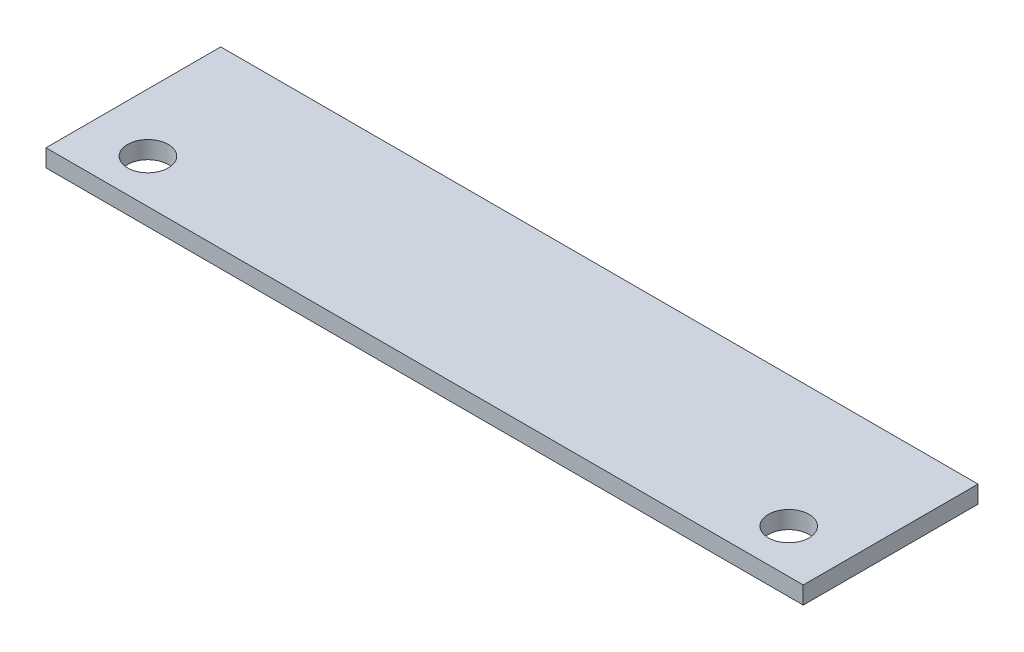
ISO-10303-21;
HEADER;
FILE_DESCRIPTION(('STEP AP214'),'2;1');
FILE_NAME('part.step','',(''),(''),'','','');
FILE_SCHEMA(('AUTOMOTIVE_DESIGN { 1 0 10303 214 1 1 1 1 }'));
ENDSEC;
DATA;
#1=APPLICATION_CONTEXT('core data for automotive mechanical design processes');
#2=APPLICATION_PROTOCOL_DEFINITION('international standard','automotive_design',2000,#1);
#3=PRODUCT_CONTEXT('',#1,'mechanical');
#4=PRODUCT('Part','Part','',(#3));
#5=PRODUCT_RELATED_PRODUCT_CATEGORY('part','',(#4));
#6=PRODUCT_DEFINITION_FORMATION('','',#4);
#7=PRODUCT_DEFINITION_CONTEXT('part definition',#1,'design');
#8=PRODUCT_DEFINITION('design','',#6,#7);
#9=PRODUCT_DEFINITION_SHAPE('','',#8);
#10=(LENGTH_UNIT() NAMED_UNIT(*) SI_UNIT(.MILLI.,.METRE.));
#11=(NAMED_UNIT(*) PLANE_ANGLE_UNIT() SI_UNIT($,.RADIAN.));
#12=(NAMED_UNIT(*) SI_UNIT($,.STERADIAN.) SOLID_ANGLE_UNIT());
#13=UNCERTAINTY_MEASURE_WITH_UNIT(LENGTH_MEASURE(1.E-05),#10,'distance_accuracy_value','');
#14=(GEOMETRIC_REPRESENTATION_CONTEXT(3) GLOBAL_UNCERTAINTY_ASSIGNED_CONTEXT((#13)) GLOBAL_UNIT_ASSIGNED_CONTEXT((#10,
#11,#12)) REPRESENTATION_CONTEXT('',''));
#15=CARTESIAN_POINT('',(0.,0.,0.));
#16=DIRECTION('',(0.,0.,1.));
#17=DIRECTION('',(1.,0.,0.));
#18=AXIS2_PLACEMENT_3D('',#15,#16,#17);
#19=CARTESIAN_POINT('',(130.,6.,30.));
#20=DIRECTION('',(-1.,0.,0.));
#21=DIRECTION('',(0.,0.,1.));
#22=AXIS2_PLACEMENT_3D('',#19,#20,#21);
#23=PLANE('',#22);
#24=DIRECTION('',(0.,0.,-1.));
#25=VECTOR('',#24,1.);
#26=CARTESIAN_POINT('',(130.,0.,30.));
#27=LINE('',#26,#25);
#28=CARTESIAN_POINT('',(130.,0.,30.));
#29=VERTEX_POINT('',#28);
#30=CARTESIAN_POINT('',(130.,0.,-30.));
#31=VERTEX_POINT('',#30);
#32=EDGE_CURVE('E96',#29,#31,#27,.T.);
#33=ORIENTED_EDGE('',*,*,#32,.T.);
#34=DIRECTION('',(0.,-1.,0.));
#35=VECTOR('',#34,1.);
#36=CARTESIAN_POINT('',(130.,6.,-30.));
#37=LINE('',#36,#35);
#38=CARTESIAN_POINT('',(130.,6.,-30.));
#39=VERTEX_POINT('',#38);
#40=EDGE_CURVE('E11',#39,#31,#37,.T.);
#41=ORIENTED_EDGE('',*,*,#40,.F.);
#42=DIRECTION('',(0.,0.,-1.));
#43=VECTOR('',#42,1.);
#44=CARTESIAN_POINT('',(130.,6.,30.));
#45=LINE('',#44,#43);
#46=CARTESIAN_POINT('',(130.,6.,30.));
#47=VERTEX_POINT('',#46);
#48=EDGE_CURVE('E84',#47,#39,#45,.T.);
#49=ORIENTED_EDGE('',*,*,#48,.F.);
#50=DIRECTION('',(0.,-1.,0.));
#51=VECTOR('',#50,1.);
#52=CARTESIAN_POINT('',(130.,6.,30.));
#53=LINE('',#52,#51);
#54=EDGE_CURVE('E92',#47,#29,#53,.T.);
#55=ORIENTED_EDGE('',*,*,#54,.T.);
#56=EDGE_LOOP('',(#33,#41,#49,#55));
#57=FACE_BOUND('',#56,.T.);
#58=ADVANCED_FACE('F33',(#57),#23,.F.);
#59=CARTESIAN_POINT('',(-130.,6.,-30.));
#60=DIRECTION('',(0.,0.,1.));
#61=DIRECTION('',(1.,0.,0.));
#62=AXIS2_PLACEMENT_3D('',#59,#60,#61);
#63=PLANE('',#62);
#64=DIRECTION('',(-1.,0.,0.));
#65=VECTOR('',#64,1.);
#66=CARTESIAN_POINT('',(-130.,0.,-30.));
#67=LINE('',#66,#65);
#68=CARTESIAN_POINT('',(-130.,0.,-30.));
#69=VERTEX_POINT('',#68);
#70=EDGE_CURVE('E88',#31,#69,#67,.T.);
#71=ORIENTED_EDGE('',*,*,#70,.T.);
#72=DIRECTION('',(0.,-1.,0.));
#73=VECTOR('',#72,1.);
#74=CARTESIAN_POINT('',(-130.,6.,-30.));
#75=LINE('',#74,#73);
#76=CARTESIAN_POINT('',(-130.,6.,-30.));
#77=VERTEX_POINT('',#76);
#78=EDGE_CURVE('E41',#77,#69,#75,.T.);
#79=ORIENTED_EDGE('',*,*,#78,.F.);
#80=DIRECTION('',(-1.,0.,0.));
#81=VECTOR('',#80,1.);
#82=CARTESIAN_POINT('',(-130.,6.,-30.));
#83=LINE('',#82,#81);
#84=EDGE_CURVE('E79',#39,#77,#83,.T.);
#85=ORIENTED_EDGE('',*,*,#84,.F.);
#86=ORIENTED_EDGE('',*,*,#40,.T.);
#87=EDGE_LOOP('',(#71,#79,#85,#86));
#88=FACE_BOUND('',#87,.T.);
#89=ADVANCED_FACE('F87',(#88),#63,.F.);
#90=CARTESIAN_POINT('',(-130.,6.,30.));
#91=DIRECTION('',(1.,0.,0.));
#92=DIRECTION('',(0.,0.,-1.));
#93=AXIS2_PLACEMENT_3D('',#90,#91,#92);
#94=PLANE('',#93);
#95=DIRECTION('',(0.,0.,1.));
#96=VECTOR('',#95,1.);
#97=CARTESIAN_POINT('',(-130.,0.,30.));
#98=LINE('',#97,#96);
#99=CARTESIAN_POINT('',(-130.,0.,30.));
#100=VERTEX_POINT('',#99);
#101=EDGE_CURVE('E66',#69,#100,#98,.T.);
#102=ORIENTED_EDGE('',*,*,#101,.T.);
#103=DIRECTION('',(0.,-1.,0.));
#104=VECTOR('',#103,1.);
#105=CARTESIAN_POINT('',(-130.,6.,30.));
#106=LINE('',#105,#104);
#107=CARTESIAN_POINT('',(-130.,6.,30.));
#108=VERTEX_POINT('',#107);
#109=EDGE_CURVE('E89',#108,#100,#106,.T.);
#110=ORIENTED_EDGE('',*,*,#109,.F.);
#111=DIRECTION('',(0.,0.,1.));
#112=VECTOR('',#111,1.);
#113=CARTESIAN_POINT('',(-130.,6.,30.));
#114=LINE('',#113,#112);
#115=EDGE_CURVE('E82',#77,#108,#114,.T.);
#116=ORIENTED_EDGE('',*,*,#115,.F.);
#117=ORIENTED_EDGE('',*,*,#78,.T.);
#118=EDGE_LOOP('',(#102,#110,#116,#117));
#119=FACE_BOUND('',#118,.T.);
#120=ADVANCED_FACE('F90',(#119),#94,.F.);
#121=CARTESIAN_POINT('',(-130.,6.,30.));
#122=DIRECTION('',(0.,0.,-1.));
#123=DIRECTION('',(-1.,0.,0.));
#124=AXIS2_PLACEMENT_3D('',#121,#122,#123);
#125=PLANE('',#124);
#126=DIRECTION('',(1.,0.,0.));
#127=VECTOR('',#126,1.);
#128=CARTESIAN_POINT('',(-130.,0.,30.));
#129=LINE('',#128,#127);
#130=EDGE_CURVE('E72',#100,#29,#129,.T.);
#131=ORIENTED_EDGE('',*,*,#130,.T.);
#132=ORIENTED_EDGE('',*,*,#54,.F.);
#133=DIRECTION('',(1.,0.,0.));
#134=VECTOR('',#133,1.);
#135=CARTESIAN_POINT('',(-130.,6.,30.));
#136=LINE('',#135,#134);
#137=EDGE_CURVE('E49',#108,#47,#136,.T.);
#138=ORIENTED_EDGE('',*,*,#137,.F.);
#139=ORIENTED_EDGE('',*,*,#109,.T.);
#140=EDGE_LOOP('',(#131,#132,#138,#139));
#141=FACE_BOUND('',#140,.T.);
#142=ADVANCED_FACE('F104',(#141),#125,.F.);
#143=CARTESIAN_POINT('',(0.,6.,0.));
#144=DIRECTION('',(0.,-1.,0.));
#145=DIRECTION('',(0.,0.,-1.));
#146=AXIS2_PLACEMENT_3D('',#143,#144,#145);
#147=PLANE('',#146);
#148=CARTESIAN_POINT('',(110.,6.,15.));
#149=DIRECTION('',(0.,-1.,0.));
#150=DIRECTION('',(0.,0.,-1.));
#151=AXIS2_PLACEMENT_3D('',#148,#149,#150);
#152=CIRCLE('',#151,7.);
#153=CARTESIAN_POINT('',(110.,6.,8.));
#154=VERTEX_POINT('',#153);
#155=EDGE_CURVE('E99',#154,#154,#152,.T.);
#156=ORIENTED_EDGE('',*,*,#155,.T.);
#157=EDGE_LOOP('',(#156));
#158=FACE_BOUND('',#157,.T.);
#159=CARTESIAN_POINT('',(-110.,6.,15.));
#160=DIRECTION('',(0.,-1.,0.));
#161=DIRECTION('',(0.,0.,-1.));
#162=AXIS2_PLACEMENT_3D('',#159,#160,#161);
#163=CIRCLE('',#162,7.);
#164=CARTESIAN_POINT('',(-110.,6.,8.));
#165=VERTEX_POINT('',#164);
#166=EDGE_CURVE('E112',#165,#165,#163,.T.);
#167=ORIENTED_EDGE('',*,*,#166,.T.);
#168=EDGE_LOOP('',(#167));
#169=FACE_BOUND('',#168,.T.);
#170=ORIENTED_EDGE('',*,*,#48,.T.);
#171=ORIENTED_EDGE('',*,*,#84,.T.);
#172=ORIENTED_EDGE('',*,*,#115,.T.);
#173=ORIENTED_EDGE('',*,*,#137,.T.);
#174=EDGE_LOOP('',(#170,#171,#172,#173));
#175=FACE_BOUND('',#174,.T.);
#176=ADVANCED_FACE('F80',(#158,#169,#175),#147,.F.);
#177=CARTESIAN_POINT('',(0.,0.,0.));
#178=DIRECTION('',(0.,-1.,0.));
#179=DIRECTION('',(0.,0.,-1.));
#180=AXIS2_PLACEMENT_3D('',#177,#178,#179);
#181=PLANE('',#180);
#182=CARTESIAN_POINT('',(110.,0.,15.));
#183=DIRECTION('',(0.,1.,0.));
#184=DIRECTION('',(0.,0.,1.));
#185=AXIS2_PLACEMENT_3D('',#182,#183,#184);
#186=CIRCLE('',#185,7.);
#187=CARTESIAN_POINT('',(110.,0.,22.));
#188=VERTEX_POINT('',#187);
#189=EDGE_CURVE('E115',#188,#188,#186,.T.);
#190=ORIENTED_EDGE('',*,*,#189,.T.);
#191=EDGE_LOOP('',(#190));
#192=FACE_BOUND('',#191,.T.);
#193=CARTESIAN_POINT('',(-110.,0.,15.));
#194=DIRECTION('',(0.,1.,0.));
#195=DIRECTION('',(0.,0.,1.));
#196=AXIS2_PLACEMENT_3D('',#193,#194,#195);
#197=CIRCLE('',#196,7.);
#198=CARTESIAN_POINT('',(-110.,0.,22.));
#199=VERTEX_POINT('',#198);
#200=EDGE_CURVE('E116',#199,#199,#197,.T.);
#201=ORIENTED_EDGE('',*,*,#200,.T.);
#202=EDGE_LOOP('',(#201));
#203=FACE_BOUND('',#202,.T.);
#204=ORIENTED_EDGE('',*,*,#32,.F.);
#205=ORIENTED_EDGE('',*,*,#130,.F.);
#206=ORIENTED_EDGE('',*,*,#101,.F.);
#207=ORIENTED_EDGE('',*,*,#70,.F.);
#208=EDGE_LOOP('',(#204,#205,#206,#207));
#209=FACE_BOUND('',#208,.T.);
#210=ADVANCED_FACE('F107',(#192,#203,#209),#181,.T.);
#211=CARTESIAN_POINT('',(-110.,0.,15.));
#212=DIRECTION('',(0.,1.,0.));
#213=DIRECTION('',(0.,0.,1.));
#214=AXIS2_PLACEMENT_3D('',#211,#212,#213);
#215=CYLINDRICAL_SURFACE('',#214,7.);
#216=ORIENTED_EDGE('',*,*,#200,.F.);
#217=EDGE_LOOP('',(#216));
#218=FACE_BOUND('',#217,.T.);
#219=ORIENTED_EDGE('',*,*,#166,.F.);
#220=EDGE_LOOP('',(#219));
#221=FACE_BOUND('',#220,.T.);
#222=ADVANCED_FACE('F127',(#218,#221),#215,.F.);
#223=CARTESIAN_POINT('',(110.,0.,15.));
#224=DIRECTION('',(0.,1.,0.));
#225=DIRECTION('',(0.,0.,1.));
#226=AXIS2_PLACEMENT_3D('',#223,#224,#225);
#227=CYLINDRICAL_SURFACE('',#226,7.);
#228=ORIENTED_EDGE('',*,*,#189,.F.);
#229=EDGE_LOOP('',(#228));
#230=FACE_BOUND('',#229,.T.);
#231=ORIENTED_EDGE('',*,*,#155,.F.);
#232=EDGE_LOOP('',(#231));
#233=FACE_BOUND('',#232,.T.);
#234=ADVANCED_FACE('F124',(#230,#233),#227,.F.);
#235=CLOSED_SHELL('',(#58,#89,#120,#142,#176,#210,#222,#234));
#236=MANIFOLD_SOLID_BREP('B2',#235);
#237=ADVANCED_BREP_SHAPE_REPRESENTATION('',(#18,#236),#14);
#238=SHAPE_DEFINITION_REPRESENTATION(#9,#237);
ENDSEC;
END-ISO-10303-21;
